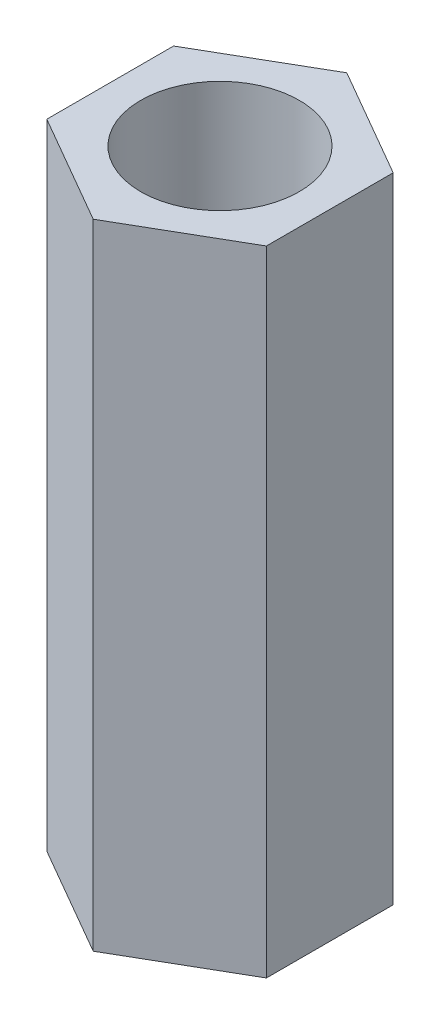
ISO-10303-21;
HEADER;
FILE_DESCRIPTION(('STEP AP214'),'2;1');
FILE_NAME('part.step','',(''),(''),'','','');
FILE_SCHEMA(('AUTOMOTIVE_DESIGN { 1 0 10303 214 1 1 1 1 }'));
ENDSEC;
DATA;
#1=APPLICATION_CONTEXT('core data for automotive mechanical design processes');
#2=APPLICATION_PROTOCOL_DEFINITION('international standard','automotive_design',2000,#1);
#3=PRODUCT_CONTEXT('',#1,'mechanical');
#4=PRODUCT('Part','Part','',(#3));
#5=PRODUCT_RELATED_PRODUCT_CATEGORY('part','',(#4));
#6=PRODUCT_DEFINITION_FORMATION('','',#4);
#7=PRODUCT_DEFINITION_CONTEXT('part definition',#1,'design');
#8=PRODUCT_DEFINITION('design','',#6,#7);
#9=PRODUCT_DEFINITION_SHAPE('','',#8);
#10=(LENGTH_UNIT() NAMED_UNIT(*) SI_UNIT(.MILLI.,.METRE.));
#11=(NAMED_UNIT(*) PLANE_ANGLE_UNIT() SI_UNIT($,.RADIAN.));
#12=(NAMED_UNIT(*) SI_UNIT($,.STERADIAN.) SOLID_ANGLE_UNIT());
#13=UNCERTAINTY_MEASURE_WITH_UNIT(LENGTH_MEASURE(1.E-05),#10,'distance_accuracy_value','');
#14=(GEOMETRIC_REPRESENTATION_CONTEXT(3) GLOBAL_UNCERTAINTY_ASSIGNED_CONTEXT((#13)) GLOBAL_UNIT_ASSIGNED_CONTEXT((#10,
#11,#12)) REPRESENTATION_CONTEXT('',''));
#15=CARTESIAN_POINT('',(0.,0.,0.));
#16=DIRECTION('',(0.,0.,1.));
#17=DIRECTION('',(1.,0.,0.));
#18=AXIS2_PLACEMENT_3D('',#15,#16,#17);
#19=CARTESIAN_POINT('',(0.,10.,0.));
#20=DIRECTION('',(0.,1.,0.));
#21=DIRECTION('',(0.,0.,1.));
#22=AXIS2_PLACEMENT_3D('',#19,#20,#21);
#23=PLANE('',#22);
#24=DIRECTION('',(-0.866025403784439,0.,-0.5));
#25=VECTOR('',#24,1.);
#26=CARTESIAN_POINT('',(1.73205080756888,10.,-1.));
#27=LINE('',#26,#25);
#28=CARTESIAN_POINT('',(1.73205080756888,10.,-1.));
#29=VERTEX_POINT('',#28);
#30=CARTESIAN_POINT('',(0.,10.,-2.));
#31=VERTEX_POINT('',#30);
#32=EDGE_CURVE('E137',#29,#31,#27,.T.);
#33=ORIENTED_EDGE('',*,*,#32,.T.);
#34=DIRECTION('',(-0.866025403784439,0.,0.5));
#35=VECTOR('',#34,1.);
#36=CARTESIAN_POINT('',(0.,10.,-2.));
#37=LINE('',#36,#35);
#38=CARTESIAN_POINT('',(-1.73205080756888,10.,-1.));
#39=VERTEX_POINT('',#38);
#40=EDGE_CURVE('E95',#31,#39,#37,.T.);
#41=ORIENTED_EDGE('',*,*,#40,.T.);
#42=DIRECTION('',(0.,0.,1.));
#43=VECTOR('',#42,1.);
#44=CARTESIAN_POINT('',(-1.73205080756888,10.,-1.));
#45=LINE('',#44,#43);
#46=CARTESIAN_POINT('',(-1.73205080756888,10.,1.));
#47=VERTEX_POINT('',#46);
#48=EDGE_CURVE('E108',#39,#47,#45,.T.);
#49=ORIENTED_EDGE('',*,*,#48,.T.);
#50=DIRECTION('',(0.866025403784439,0.,0.5));
#51=VECTOR('',#50,1.);
#52=CARTESIAN_POINT('',(-1.73205080756888,10.,1.));
#53=LINE('',#52,#51);
#54=CARTESIAN_POINT('',(0.,10.,2.));
#55=VERTEX_POINT('',#54);
#56=EDGE_CURVE('E102',#47,#55,#53,.T.);
#57=ORIENTED_EDGE('',*,*,#56,.T.);
#58=DIRECTION('',(0.866025403784439,0.,-0.5));
#59=VECTOR('',#58,1.);
#60=CARTESIAN_POINT('',(0.,10.,2.));
#61=LINE('',#60,#59);
#62=CARTESIAN_POINT('',(1.73205080756888,10.,1.));
#63=VERTEX_POINT('',#62);
#64=EDGE_CURVE('E106',#55,#63,#61,.T.);
#65=ORIENTED_EDGE('',*,*,#64,.T.);
#66=DIRECTION('',(0.,0.,-1.));
#67=VECTOR('',#66,1.);
#68=CARTESIAN_POINT('',(1.73205080756888,10.,1.));
#69=LINE('',#68,#67);
#70=EDGE_CURVE('E58',#63,#29,#69,.T.);
#71=ORIENTED_EDGE('',*,*,#70,.T.);
#72=EDGE_LOOP('',(#33,#41,#49,#57,#65,#71));
#73=FACE_BOUND('',#72,.T.);
#74=CARTESIAN_POINT('',(0.,10.,0.));
#75=DIRECTION('',(0.,1.,0.));
#76=DIRECTION('',(0.,0.,1.));
#77=AXIS2_PLACEMENT_3D('',#74,#75,#76);
#78=CIRCLE('',#77,1.25);
#79=CARTESIAN_POINT('',(0.,10.,1.25));
#80=VERTEX_POINT('',#79);
#81=EDGE_CURVE('E130',#80,#80,#78,.T.);
#82=ORIENTED_EDGE('',*,*,#81,.F.);
#83=EDGE_LOOP('',(#82));
#84=FACE_BOUND('',#83,.T.);
#85=ADVANCED_FACE('F41',(#73,#84),#23,.T.);
#86=CARTESIAN_POINT('',(0.,0.,0.));
#87=DIRECTION('',(0.,1.,0.));
#88=DIRECTION('',(0.,0.,1.));
#89=AXIS2_PLACEMENT_3D('',#86,#87,#88);
#90=PLANE('',#89);
#91=DIRECTION('',(-0.866025403784439,0.,-0.5));
#92=VECTOR('',#91,1.);
#93=CARTESIAN_POINT('',(1.73205080756888,0.,-1.));
#94=LINE('',#93,#92);
#95=CARTESIAN_POINT('',(1.73205080756888,0.,-1.));
#96=VERTEX_POINT('',#95);
#97=CARTESIAN_POINT('',(0.,0.,-2.));
#98=VERTEX_POINT('',#97);
#99=EDGE_CURVE('E126',#96,#98,#94,.T.);
#100=ORIENTED_EDGE('',*,*,#99,.F.);
#101=DIRECTION('',(0.,0.,-1.));
#102=VECTOR('',#101,1.);
#103=CARTESIAN_POINT('',(1.73205080756888,0.,1.));
#104=LINE('',#103,#102);
#105=CARTESIAN_POINT('',(1.73205080756888,0.,1.));
#106=VERTEX_POINT('',#105);
#107=EDGE_CURVE('E87',#106,#96,#104,.T.);
#108=ORIENTED_EDGE('',*,*,#107,.F.);
#109=DIRECTION('',(0.866025403784439,0.,-0.5));
#110=VECTOR('',#109,1.);
#111=CARTESIAN_POINT('',(0.,0.,2.));
#112=LINE('',#111,#110);
#113=CARTESIAN_POINT('',(0.,0.,2.));
#114=VERTEX_POINT('',#113);
#115=EDGE_CURVE('E81',#114,#106,#112,.T.);
#116=ORIENTED_EDGE('',*,*,#115,.F.);
#117=DIRECTION('',(0.866025403784439,0.,0.5));
#118=VECTOR('',#117,1.);
#119=CARTESIAN_POINT('',(-1.73205080756888,0.,1.));
#120=LINE('',#119,#118);
#121=CARTESIAN_POINT('',(-1.73205080756888,0.,1.));
#122=VERTEX_POINT('',#121);
#123=EDGE_CURVE('E116',#122,#114,#120,.T.);
#124=ORIENTED_EDGE('',*,*,#123,.F.);
#125=DIRECTION('',(0.,0.,1.));
#126=VECTOR('',#125,1.);
#127=CARTESIAN_POINT('',(-1.73205080756888,0.,-1.));
#128=LINE('',#127,#126);
#129=CARTESIAN_POINT('',(-1.73205080756888,0.,-1.));
#130=VERTEX_POINT('',#129);
#131=EDGE_CURVE('E132',#130,#122,#128,.T.);
#132=ORIENTED_EDGE('',*,*,#131,.F.);
#133=DIRECTION('',(-0.866025403784439,0.,0.5));
#134=VECTOR('',#133,1.);
#135=CARTESIAN_POINT('',(0.,0.,-2.));
#136=LINE('',#135,#134);
#137=EDGE_CURVE('E129',#98,#130,#136,.T.);
#138=ORIENTED_EDGE('',*,*,#137,.F.);
#139=EDGE_LOOP('',(#100,#108,#116,#124,#132,#138));
#140=FACE_BOUND('',#139,.T.);
#141=CARTESIAN_POINT('',(0.,0.,0.));
#142=DIRECTION('',(0.,1.,0.));
#143=DIRECTION('',(0.,0.,1.));
#144=AXIS2_PLACEMENT_3D('',#141,#142,#143);
#145=CIRCLE('',#144,1.25);
#146=CARTESIAN_POINT('',(0.,0.,1.25));
#147=VERTEX_POINT('',#146);
#148=EDGE_CURVE('E230',#147,#147,#145,.T.);
#149=ORIENTED_EDGE('',*,*,#148,.T.);
#150=EDGE_LOOP('',(#149));
#151=FACE_BOUND('',#150,.T.);
#152=ADVANCED_FACE('F146',(#140,#151),#90,.F.);
#153=CARTESIAN_POINT('',(1.73205080756888,10.,-1.));
#154=DIRECTION('',(-0.5,0.,0.866025403784439));
#155=DIRECTION('',(0.866025403784439,0.,0.5));
#156=AXIS2_PLACEMENT_3D('',#153,#154,#155);
#157=PLANE('',#156);
#158=ORIENTED_EDGE('',*,*,#99,.T.);
#159=DIRECTION('',(0.,-1.,0.));
#160=VECTOR('',#159,1.);
#161=CARTESIAN_POINT('',(0.,10.,-2.));
#162=LINE('',#161,#160);
#163=EDGE_CURVE('E11',#31,#98,#162,.T.);
#164=ORIENTED_EDGE('',*,*,#163,.F.);
#165=ORIENTED_EDGE('',*,*,#32,.F.);
#166=DIRECTION('',(0.,-1.,0.));
#167=VECTOR('',#166,1.);
#168=CARTESIAN_POINT('',(1.73205080756888,10.,-1.));
#169=LINE('',#168,#167);
#170=EDGE_CURVE('E122',#29,#96,#169,.T.);
#171=ORIENTED_EDGE('',*,*,#170,.T.);
#172=EDGE_LOOP('',(#158,#164,#165,#171));
#173=FACE_BOUND('',#172,.T.);
#174=ADVANCED_FACE('F43',(#173),#157,.F.);
#175=CARTESIAN_POINT('',(0.,10.,-2.));
#176=DIRECTION('',(0.5,0.,0.866025403784439));
#177=DIRECTION('',(0.866025403784439,0.,-0.5));
#178=AXIS2_PLACEMENT_3D('',#175,#176,#177);
#179=PLANE('',#178);
#180=ORIENTED_EDGE('',*,*,#137,.T.);
#181=DIRECTION('',(0.,-1.,0.));
#182=VECTOR('',#181,1.);
#183=CARTESIAN_POINT('',(-1.73205080756888,10.,-1.));
#184=LINE('',#183,#182);
#185=EDGE_CURVE('E50',#39,#130,#184,.T.);
#186=ORIENTED_EDGE('',*,*,#185,.F.);
#187=ORIENTED_EDGE('',*,*,#40,.F.);
#188=ORIENTED_EDGE('',*,*,#163,.T.);
#189=EDGE_LOOP('',(#180,#186,#187,#188));
#190=FACE_BOUND('',#189,.T.);
#191=ADVANCED_FACE('F171',(#190),#179,.F.);
#192=CARTESIAN_POINT('',(-1.73205080756888,10.,-1.));
#193=DIRECTION('',(1.,0.,0.));
#194=DIRECTION('',(0.,0.,-1.));
#195=AXIS2_PLACEMENT_3D('',#192,#193,#194);
#196=PLANE('',#195);
#197=ORIENTED_EDGE('',*,*,#131,.T.);
#198=DIRECTION('',(0.,-1.,0.));
#199=VECTOR('',#198,1.);
#200=CARTESIAN_POINT('',(-1.73205080756888,10.,1.));
#201=LINE('',#200,#199);
#202=EDGE_CURVE('E117',#47,#122,#201,.T.);
#203=ORIENTED_EDGE('',*,*,#202,.F.);
#204=ORIENTED_EDGE('',*,*,#48,.F.);
#205=ORIENTED_EDGE('',*,*,#185,.T.);
#206=EDGE_LOOP('',(#197,#203,#204,#205));
#207=FACE_BOUND('',#206,.T.);
#208=ADVANCED_FACE('F143',(#207),#196,.F.);
#209=CARTESIAN_POINT('',(-1.73205080756888,10.,1.));
#210=DIRECTION('',(0.5,0.,-0.866025403784438));
#211=DIRECTION('',(-0.866025403784439,0.,-0.5));
#212=AXIS2_PLACEMENT_3D('',#209,#210,#211);
#213=PLANE('',#212);
#214=ORIENTED_EDGE('',*,*,#123,.T.);
#215=DIRECTION('',(0.,-1.,0.));
#216=VECTOR('',#215,1.);
#217=CARTESIAN_POINT('',(0.,10.,2.));
#218=LINE('',#217,#216);
#219=EDGE_CURVE('E113',#55,#114,#218,.T.);
#220=ORIENTED_EDGE('',*,*,#219,.F.);
#221=ORIENTED_EDGE('',*,*,#56,.F.);
#222=ORIENTED_EDGE('',*,*,#202,.T.);
#223=EDGE_LOOP('',(#214,#220,#221,#222));
#224=FACE_BOUND('',#223,.T.);
#225=ADVANCED_FACE('F114',(#224),#213,.F.);
#226=CARTESIAN_POINT('',(0.,10.,2.));
#227=DIRECTION('',(-0.5,0.,-0.866025403784439));
#228=DIRECTION('',(-0.866025403784439,0.,0.5));
#229=AXIS2_PLACEMENT_3D('',#226,#227,#228);
#230=PLANE('',#229);
#231=ORIENTED_EDGE('',*,*,#115,.T.);
#232=DIRECTION('',(0.,-1.,0.));
#233=VECTOR('',#232,1.);
#234=CARTESIAN_POINT('',(1.73205080756888,10.,1.));
#235=LINE('',#234,#233);
#236=EDGE_CURVE('E118',#63,#106,#235,.T.);
#237=ORIENTED_EDGE('',*,*,#236,.F.);
#238=ORIENTED_EDGE('',*,*,#64,.F.);
#239=ORIENTED_EDGE('',*,*,#219,.T.);
#240=EDGE_LOOP('',(#231,#237,#238,#239));
#241=FACE_BOUND('',#240,.T.);
#242=ADVANCED_FACE('F120',(#241),#230,.F.);
#243=CARTESIAN_POINT('',(1.73205080756888,10.,1.));
#244=DIRECTION('',(-1.,0.,0.));
#245=DIRECTION('',(0.,0.,1.));
#246=AXIS2_PLACEMENT_3D('',#243,#244,#245);
#247=PLANE('',#246);
#248=ORIENTED_EDGE('',*,*,#107,.T.);
#249=ORIENTED_EDGE('',*,*,#170,.F.);
#250=ORIENTED_EDGE('',*,*,#70,.F.);
#251=ORIENTED_EDGE('',*,*,#236,.T.);
#252=EDGE_LOOP('',(#248,#249,#250,#251));
#253=FACE_BOUND('',#252,.T.);
#254=ADVANCED_FACE('F151',(#253),#247,.F.);
#255=CARTESIAN_POINT('',(0.,10.,0.));
#256=DIRECTION('',(0.,-1.,0.));
#257=DIRECTION('',(0.,0.,-1.));
#258=AXIS2_PLACEMENT_3D('',#255,#256,#257);
#259=CYLINDRICAL_SURFACE('',#258,1.25);
#260=ORIENTED_EDGE('',*,*,#81,.T.);
#261=EDGE_LOOP('',(#260));
#262=FACE_BOUND('',#261,.T.);
#263=ORIENTED_EDGE('',*,*,#148,.F.);
#264=EDGE_LOOP('',(#263));
#265=FACE_BOUND('',#264,.T.);
#266=ADVANCED_FACE('F153',(#262,#265),#259,.F.);
#267=CLOSED_SHELL('',(#85,#152,#174,#191,#208,#225,#242,#254,#266));
#268=MANIFOLD_SOLID_BREP('B2',#267);
#269=ADVANCED_BREP_SHAPE_REPRESENTATION('',(#18,#268),#14);
#270=SHAPE_DEFINITION_REPRESENTATION(#9,#269);
ENDSEC;
END-ISO-10303-21;
